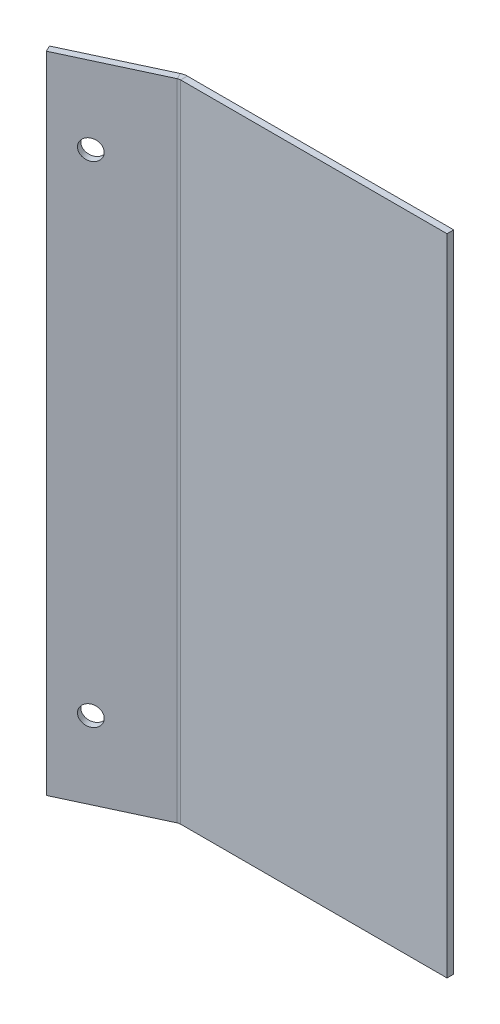
ISO-10303-21;
HEADER;
FILE_DESCRIPTION(('STEP AP214'),'2;1');
FILE_NAME('part.step','',(''),(''),'','','');
FILE_SCHEMA(('AUTOMOTIVE_DESIGN { 1 0 10303 214 1 1 1 1 }'));
ENDSEC;
DATA;
#1=APPLICATION_CONTEXT('core data for automotive mechanical design processes');
#2=APPLICATION_PROTOCOL_DEFINITION('international standard','automotive_design',2000,#1);
#3=PRODUCT_CONTEXT('',#1,'mechanical');
#4=PRODUCT('Part','Part','',(#3));
#5=PRODUCT_RELATED_PRODUCT_CATEGORY('part','',(#4));
#6=PRODUCT_DEFINITION_FORMATION('','',#4);
#7=PRODUCT_DEFINITION_CONTEXT('part definition',#1,'design');
#8=PRODUCT_DEFINITION('design','',#6,#7);
#9=PRODUCT_DEFINITION_SHAPE('','',#8);
#10=(LENGTH_UNIT() NAMED_UNIT(*) SI_UNIT(.MILLI.,.METRE.));
#11=(NAMED_UNIT(*) PLANE_ANGLE_UNIT() SI_UNIT($,.RADIAN.));
#12=(NAMED_UNIT(*) SI_UNIT($,.STERADIAN.) SOLID_ANGLE_UNIT());
#13=UNCERTAINTY_MEASURE_WITH_UNIT(LENGTH_MEASURE(1.E-05),#10,'distance_accuracy_value','');
#14=(GEOMETRIC_REPRESENTATION_CONTEXT(3) GLOBAL_UNCERTAINTY_ASSIGNED_CONTEXT((#13)) GLOBAL_UNIT_ASSIGNED_CONTEXT((#10,
#11,#12)) REPRESENTATION_CONTEXT('',''));
#15=CARTESIAN_POINT('',(0.,0.,0.));
#16=DIRECTION('',(0.,0.,1.));
#17=DIRECTION('',(1.,0.,0.));
#18=AXIS2_PLACEMENT_3D('',#15,#16,#17);
#19=CARTESIAN_POINT('',(11.1796299005498,-15.7574239713775,50.4757998482065));
#20=DIRECTION('',(0.,-1.,0.));
#21=DIRECTION('',(0.90630778703665,0.,-0.4226182617407));
#22=AXIS2_PLACEMENT_3D('',#19,#20,#21);
#23=PLANE('',#22);
#24=DIRECTION('',(0.90630778703665,0.,-0.4226182617407));
#25=VECTOR('',#24,1.);
#26=CARTESIAN_POINT('',(10.7570116388091,-15.7574239713774,49.5694920611699));
#27=LINE('',#26,#25);
#28=CARTESIAN_POINT('',(103.359254936141,-15.7574239713775,6.38835684929166));
#29=VERTEX_POINT('',#28);
#30=CARTESIAN_POINT('',(116.657283211936,-15.7574239713774,0.187384425926738));
#31=VERTEX_POINT('',#30);
#32=EDGE_CURVE('E165',#29,#31,#27,.T.);
#33=ORIENTED_EDGE('',*,*,#32,.T.);
#34=DIRECTION('',(0.4226182617407,0.,0.90630778703665));
#35=VECTOR('',#34,1.);
#36=CARTESIAN_POINT('',(117.079901473676,-15.7574239713775,1.09369221296335));
#37=LINE('',#36,#35);
#38=CARTESIAN_POINT('',(117.079901473676,-15.7574239713774,1.09369221296337));
#39=VERTEX_POINT('',#38);
#40=EDGE_CURVE('E124',#31,#39,#37,.T.);
#41=ORIENTED_EDGE('',*,*,#40,.T.);
#42=DIRECTION('',(0.90630778703665,0.,-0.4226182617407));
#43=VECTOR('',#42,1.);
#44=CARTESIAN_POINT('',(11.1796299005498,-15.7574239713775,50.4757998482065));
#45=LINE('',#44,#43);
#46=CARTESIAN_POINT('',(103.781873197881,-15.7574239713775,7.29466463632831));
#47=VERTEX_POINT('',#46);
#48=EDGE_CURVE('E45',#47,#39,#45,.T.);
#49=ORIENTED_EDGE('',*,*,#48,.F.);
#50=DIRECTION('',(0.4226182617407,0.,0.90630778703665));
#51=VECTOR('',#50,1.);
#52=CARTESIAN_POINT('',(103.781873197881,-15.7574239713775,7.29466463632831));
#53=LINE('',#52,#51);
#54=EDGE_CURVE('E67',#29,#47,#53,.T.);
#55=ORIENTED_EDGE('',*,*,#54,.F.);
#56=EDGE_LOOP('',(#33,#41,#49,#55));
#57=FACE_BOUND('',#56,.T.);
#58=ADVANCED_FACE('F41',(#57),#23,.T.);
#59=CARTESIAN_POINT('',(11.1796299005498,80.2425760286226,50.4757998482064));
#60=DIRECTION('',(0.,-1.,0.));
#61=DIRECTION('',(0.90630778703665,0.,-0.4226182617407));
#62=AXIS2_PLACEMENT_3D('',#59,#60,#61);
#63=PLANE('',#62);
#64=DIRECTION('',(0.90630778703665,0.,-0.4226182617407));
#65=VECTOR('',#64,1.);
#66=CARTESIAN_POINT('',(11.1796299005498,80.2425760286226,50.4757998482064));
#67=LINE('',#66,#65);
#68=CARTESIAN_POINT('',(103.781873197881,80.2425760286226,7.29466463632829));
#69=VERTEX_POINT('',#68);
#70=CARTESIAN_POINT('',(117.079901473676,80.2425760286225,1.09369221296336));
#71=VERTEX_POINT('',#70);
#72=EDGE_CURVE('E156',#69,#71,#67,.T.);
#73=ORIENTED_EDGE('',*,*,#72,.T.);
#74=DIRECTION('',(-0.4226182617407,0.,-0.90630778703665));
#75=VECTOR('',#74,1.);
#76=CARTESIAN_POINT('',(117.079901473676,80.2425760286225,1.09369221296336));
#77=LINE('',#76,#75);
#78=CARTESIAN_POINT('',(116.657283211935,80.2425760286226,0.187384425926738));
#79=VERTEX_POINT('',#78);
#80=EDGE_CURVE('E12',#71,#79,#77,.T.);
#81=ORIENTED_EDGE('',*,*,#80,.T.);
#82=DIRECTION('',(0.90630778703665,0.,-0.4226182617407));
#83=VECTOR('',#82,1.);
#84=CARTESIAN_POINT('',(10.7570116388091,80.2425760286226,49.5694920611697));
#85=LINE('',#84,#83);
#86=CARTESIAN_POINT('',(103.35925493614,80.2425760286226,6.38835684929165));
#87=VERTEX_POINT('',#86);
#88=EDGE_CURVE('E148',#87,#79,#85,.T.);
#89=ORIENTED_EDGE('',*,*,#88,.F.);
#90=DIRECTION('',(0.4226182617407,0.,0.90630778703665));
#91=VECTOR('',#90,1.);
#92=CARTESIAN_POINT('',(103.781873197881,80.2425760286226,7.29466463632829));
#93=LINE('',#92,#91);
#94=EDGE_CURVE('E77',#87,#69,#93,.T.);
#95=ORIENTED_EDGE('',*,*,#94,.T.);
#96=EDGE_LOOP('',(#73,#81,#89,#95));
#97=FACE_BOUND('',#96,.T.);
#98=ADVANCED_FACE('F43',(#97),#63,.F.);
#99=CARTESIAN_POINT('',(11.1796299005498,0.,50.4757998482065));
#100=DIRECTION('',(0.4226182617407,0.,0.90630778703665));
#101=DIRECTION('',(0.90630778703665,0.,-0.4226182617407));
#102=AXIS2_PLACEMENT_3D('',#99,#100,#101);
#103=PLANE('',#102);
#104=CARTESIAN_POINT('',(108.313412133065,-4.25742397137746,5.18157332762481));
#105=DIRECTION('',(0.4226182617407,0.,0.90630778703665));
#106=DIRECTION('',(0.90630778703665,0.,-0.4226182617407));
#107=AXIS2_PLACEMENT_3D('',#104,#105,#106);
#108=CIRCLE('',#107,1.5);
#109=CARTESIAN_POINT('',(109.67287381362,-4.25742397137746,4.54764593501376));
#110=VERTEX_POINT('',#109);
#111=EDGE_CURVE('E180',#110,#110,#108,.T.);
#112=ORIENTED_EDGE('',*,*,#111,.F.);
#113=EDGE_LOOP('',(#112));
#114=FACE_BOUND('',#113,.T.);
#115=CARTESIAN_POINT('',(108.313412133064,68.7425760286226,5.18157332762479));
#116=DIRECTION('',(0.4226182617407,0.,0.90630778703665));
#117=DIRECTION('',(0.90630778703665,0.,-0.4226182617407));
#118=AXIS2_PLACEMENT_3D('',#115,#116,#117);
#119=CIRCLE('',#118,1.5);
#120=CARTESIAN_POINT('',(109.672873813619,68.7425760286226,4.54764593501374));
#121=VERTEX_POINT('',#120);
#122=EDGE_CURVE('E171',#121,#121,#119,.T.);
#123=ORIENTED_EDGE('',*,*,#122,.F.);
#124=EDGE_LOOP('',(#123));
#125=FACE_BOUND('',#124,.T.);
#126=ORIENTED_EDGE('',*,*,#48,.T.);
#127=DIRECTION('',(0.,1.,0.));
#128=VECTOR('',#127,1.);
#129=CARTESIAN_POINT('',(117.079901473676,4.10514989483924E-13,1.09369221296336));
#130=LINE('',#129,#128);
#131=EDGE_CURVE('E175',#39,#71,#130,.T.);
#132=ORIENTED_EDGE('',*,*,#131,.T.);
#133=ORIENTED_EDGE('',*,*,#72,.F.);
#134=DIRECTION('',(0.,-1.,0.));
#135=VECTOR('',#134,1.);
#136=CARTESIAN_POINT('',(103.781873197881,3.20066725715026E-13,7.29466463632831));
#137=LINE('',#136,#135);
#138=EDGE_CURVE('E158',#69,#47,#137,.T.);
#139=ORIENTED_EDGE('',*,*,#138,.T.);
#140=EDGE_LOOP('',(#126,#132,#133,#139));
#141=FACE_BOUND('',#140,.T.);
#142=ADVANCED_FACE('F237',(#114,#125,#141),#103,.T.);
#143=CARTESIAN_POINT('',(103.781873197881,3.20066725715026E-13,7.29466463632831));
#144=DIRECTION('',(-0.90630778703665,0.,0.4226182617407));
#145=DIRECTION('',(0.,-1.,0.));
#146=AXIS2_PLACEMENT_3D('',#143,#144,#145);
#147=PLANE('',#146);
#148=DIRECTION('',(0.,1.,0.));
#149=VECTOR('',#148,1.);
#150=CARTESIAN_POINT('',(103.35925493614,0.,6.38835684929177));
#151=LINE('',#150,#149);
#152=EDGE_CURVE('E151',#87,#29,#151,.F.);
#153=ORIENTED_EDGE('',*,*,#152,.T.);
#154=ORIENTED_EDGE('',*,*,#54,.T.);
#155=ORIENTED_EDGE('',*,*,#138,.F.);
#156=ORIENTED_EDGE('',*,*,#94,.F.);
#157=EDGE_LOOP('',(#153,#154,#155,#156));
#158=FACE_BOUND('',#157,.T.);
#159=ADVANCED_FACE('F250',(#158),#147,.T.);
#160=CARTESIAN_POINT('',(108.313412133065,-4.25742397137746,5.18157332762481));
#161=DIRECTION('',(0.4226182617407,0.,0.90630778703665));
#162=DIRECTION('',(0.90630778703665,0.,-0.4226182617407));
#163=AXIS2_PLACEMENT_3D('',#160,#161,#162);
#164=CYLINDRICAL_SURFACE('',#163,1.5);
#165=ORIENTED_EDGE('',*,*,#111,.T.);
#166=EDGE_LOOP('',(#165));
#167=FACE_BOUND('',#166,.T.);
#168=CARTESIAN_POINT('',(107.890793871324,-4.25742397137746,4.27526554058816));
#169=DIRECTION('',(0.4226182617407,0.,0.90630778703665));
#170=DIRECTION('',(0.90630778703665,0.,-0.4226182617407));
#171=AXIS2_PLACEMENT_3D('',#168,#169,#170);
#172=CIRCLE('',#171,1.5);
#173=CARTESIAN_POINT('',(109.250255551879,-4.25742397137746,3.64133814797712));
#174=VERTEX_POINT('',#173);
#175=EDGE_CURVE('E163',#174,#174,#172,.T.);
#176=ORIENTED_EDGE('',*,*,#175,.F.);
#177=EDGE_LOOP('',(#176));
#178=FACE_BOUND('',#177,.T.);
#179=ADVANCED_FACE('F245',(#167,#178),#164,.F.);
#180=CARTESIAN_POINT('',(108.313412133064,68.7425760286226,5.18157332762479));
#181=DIRECTION('',(0.4226182617407,0.,0.90630778703665));
#182=DIRECTION('',(0.90630778703665,0.,-0.4226182617407));
#183=AXIS2_PLACEMENT_3D('',#180,#181,#182);
#184=CYLINDRICAL_SURFACE('',#183,1.5);
#185=ORIENTED_EDGE('',*,*,#122,.T.);
#186=EDGE_LOOP('',(#185));
#187=FACE_BOUND('',#186,.T.);
#188=CARTESIAN_POINT('',(107.890793871324,68.7425760286226,4.27526554058814));
#189=DIRECTION('',(0.4226182617407,0.,0.90630778703665));
#190=DIRECTION('',(0.90630778703665,0.,-0.4226182617407));
#191=AXIS2_PLACEMENT_3D('',#188,#189,#190);
#192=CIRCLE('',#191,1.5);
#193=CARTESIAN_POINT('',(109.250255551879,68.7425760286226,3.64133814797709));
#194=VERTEX_POINT('',#193);
#195=EDGE_CURVE('E159',#194,#194,#192,.T.);
#196=ORIENTED_EDGE('',*,*,#195,.F.);
#197=EDGE_LOOP('',(#196));
#198=FACE_BOUND('',#197,.T.);
#199=ADVANCED_FACE('F241',(#187,#198),#184,.F.);
#200=CARTESIAN_POINT('',(10.7570116388091,0.,49.5694920611699));
#201=DIRECTION('',(0.4226182617407,0.,0.90630778703665));
#202=DIRECTION('',(0.90630778703665,0.,-0.4226182617407));
#203=AXIS2_PLACEMENT_3D('',#200,#201,#202);
#204=PLANE('',#203);
#205=DIRECTION('',(0.,1.,0.));
#206=VECTOR('',#205,1.);
#207=CARTESIAN_POINT('',(116.657283211936,4.09048737843887E-13,0.187384425926709));
#208=LINE('',#207,#206);
#209=EDGE_CURVE('E50',#31,#79,#208,.T.);
#210=ORIENTED_EDGE('',*,*,#209,.F.);
#211=ORIENTED_EDGE('',*,*,#32,.F.);
#212=ORIENTED_EDGE('',*,*,#152,.F.);
#213=ORIENTED_EDGE('',*,*,#88,.T.);
#214=EDGE_LOOP('',(#210,#211,#212,#213));
#215=FACE_BOUND('',#214,.T.);
#216=ORIENTED_EDGE('',*,*,#175,.T.);
#217=EDGE_LOOP('',(#216));
#218=FACE_BOUND('',#217,.T.);
#219=ORIENTED_EDGE('',*,*,#195,.T.);
#220=EDGE_LOOP('',(#219));
#221=FACE_BOUND('',#220,.T.);
#222=ADVANCED_FACE('F149',(#215,#218,#221),#204,.F.);
#223=CARTESIAN_POINT('',(157.175270500668,0.,1.));
#224=DIRECTION('',(-1.,0.,0.));
#225=DIRECTION('',(0.,-1.,0.));
#226=AXIS2_PLACEMENT_3D('',#223,#224,#225);
#227=PLANE('',#226);
#228=DIRECTION('',(0.,0.,1.));
#229=VECTOR('',#228,1.);
#230=CARTESIAN_POINT('',(157.175270500668,-15.7574239713775,1.));
#231=LINE('',#230,#229);
#232=CARTESIAN_POINT('',(157.175270500668,-15.7574239713775,0.));
#233=VERTEX_POINT('',#232);
#234=CARTESIAN_POINT('',(157.175270500668,-15.7574239713775,1.));
#235=VERTEX_POINT('',#234);
#236=EDGE_CURVE('E200',#233,#235,#231,.T.);
#237=ORIENTED_EDGE('',*,*,#236,.F.);
#238=DIRECTION('',(0.,1.,0.));
#239=VECTOR('',#238,1.);
#240=CARTESIAN_POINT('',(157.175270500668,0.,0.));
#241=LINE('',#240,#239);
#242=CARTESIAN_POINT('',(157.175270500668,80.2425760286225,0.));
#243=VERTEX_POINT('',#242);
#244=EDGE_CURVE('E207',#243,#233,#241,.F.);
#245=ORIENTED_EDGE('',*,*,#244,.F.);
#246=DIRECTION('',(0.,0.,1.));
#247=VECTOR('',#246,1.);
#248=CARTESIAN_POINT('',(157.175270500668,80.2425760286225,1.));
#249=LINE('',#248,#247);
#250=CARTESIAN_POINT('',(157.175270500668,80.2425760286225,1.));
#251=VERTEX_POINT('',#250);
#252=EDGE_CURVE('E192',#243,#251,#249,.T.);
#253=ORIENTED_EDGE('',*,*,#252,.T.);
#254=DIRECTION('',(0.,-1.,0.));
#255=VECTOR('',#254,1.);
#256=CARTESIAN_POINT('',(157.175270500668,0.,1.));
#257=LINE('',#256,#255);
#258=EDGE_CURVE('E194',#251,#235,#257,.T.);
#259=ORIENTED_EDGE('',*,*,#258,.T.);
#260=EDGE_LOOP('',(#237,#245,#253,#259));
#261=FACE_BOUND('',#260,.T.);
#262=ADVANCED_FACE('F222',(#261),#227,.F.);
#263=CARTESIAN_POINT('',(0.,0.,1.));
#264=DIRECTION('',(0.,0.,1.));
#265=DIRECTION('',(1.,0.,0.));
#266=AXIS2_PLACEMENT_3D('',#263,#264,#265);
#267=PLANE('',#266);
#268=DIRECTION('',(0.,1.,0.));
#269=VECTOR('',#268,1.);
#270=CARTESIAN_POINT('',(117.502519735417,4.07668758942912E-13,1.));
#271=LINE('',#270,#269);
#272=CARTESIAN_POINT('',(117.502519735417,-15.7574239713774,1.));
#273=VERTEX_POINT('',#272);
#274=CARTESIAN_POINT('',(117.502519735417,80.2425760286225,1.));
#275=VERTEX_POINT('',#274);
#276=EDGE_CURVE('E186',#273,#275,#271,.T.);
#277=ORIENTED_EDGE('',*,*,#276,.F.);
#278=DIRECTION('',(1.,0.,0.));
#279=VECTOR('',#278,1.);
#280=CARTESIAN_POINT('',(0.,-15.7574239713775,1.));
#281=LINE('',#280,#279);
#282=EDGE_CURVE('E116',#273,#235,#281,.T.);
#283=ORIENTED_EDGE('',*,*,#282,.T.);
#284=ORIENTED_EDGE('',*,*,#258,.F.);
#285=DIRECTION('',(1.,0.,0.));
#286=VECTOR('',#285,1.);
#287=CARTESIAN_POINT('',(0.,80.2425760286225,1.));
#288=LINE('',#287,#286);
#289=EDGE_CURVE('E86',#275,#251,#288,.T.);
#290=ORIENTED_EDGE('',*,*,#289,.F.);
#291=EDGE_LOOP('',(#277,#283,#284,#290));
#292=FACE_BOUND('',#291,.T.);
#293=ADVANCED_FACE('F223',(#292),#267,.T.);
#294=CARTESIAN_POINT('',(0.,-15.7574239713775,1.));
#295=DIRECTION('',(0.,-1.,0.));
#296=DIRECTION('',(1.,0.,0.));
#297=AXIS2_PLACEMENT_3D('',#294,#295,#296);
#298=PLANE('',#297);
#299=DIRECTION('',(0.,0.,1.));
#300=VECTOR('',#299,1.);
#301=CARTESIAN_POINT('',(117.502519735417,-15.7574239713775,1.));
#302=LINE('',#301,#300);
#303=CARTESIAN_POINT('',(117.502519735417,-15.7574239713775,0.));
#304=VERTEX_POINT('',#303);
#305=EDGE_CURVE('E189',#304,#273,#302,.T.);
#306=ORIENTED_EDGE('',*,*,#305,.F.);
#307=DIRECTION('',(1.,0.,0.));
#308=VECTOR('',#307,1.);
#309=CARTESIAN_POINT('',(0.,-15.7574239713775,0.));
#310=LINE('',#309,#308);
#311=EDGE_CURVE('E198',#304,#233,#310,.T.);
#312=ORIENTED_EDGE('',*,*,#311,.T.);
#313=ORIENTED_EDGE('',*,*,#236,.T.);
#314=ORIENTED_EDGE('',*,*,#282,.F.);
#315=EDGE_LOOP('',(#306,#312,#313,#314));
#316=FACE_BOUND('',#315,.T.);
#317=ADVANCED_FACE('F216',(#316),#298,.T.);
#318=CARTESIAN_POINT('',(0.,0.,0.));
#319=DIRECTION('',(0.,0.,1.));
#320=DIRECTION('',(1.,0.,0.));
#321=AXIS2_PLACEMENT_3D('',#318,#319,#320);
#322=PLANE('',#321);
#323=ORIENTED_EDGE('',*,*,#311,.F.);
#324=DIRECTION('',(0.,1.,0.));
#325=VECTOR('',#324,1.);
#326=CARTESIAN_POINT('',(117.502519735417,4.07668758942912E-13,0.));
#327=LINE('',#326,#325);
#328=CARTESIAN_POINT('',(117.502519735417,80.2425760286225,0.));
#329=VERTEX_POINT('',#328);
#330=EDGE_CURVE('E202',#304,#329,#327,.T.);
#331=ORIENTED_EDGE('',*,*,#330,.T.);
#332=DIRECTION('',(1.,0.,0.));
#333=VECTOR('',#332,1.);
#334=CARTESIAN_POINT('',(0.,80.2425760286225,0.));
#335=LINE('',#334,#333);
#336=EDGE_CURVE('E205',#329,#243,#335,.T.);
#337=ORIENTED_EDGE('',*,*,#336,.T.);
#338=ORIENTED_EDGE('',*,*,#244,.T.);
#339=EDGE_LOOP('',(#323,#331,#337,#338));
#340=FACE_BOUND('',#339,.T.);
#341=ADVANCED_FACE('F219',(#340),#322,.F.);
#342=CARTESIAN_POINT('',(0.,80.2425760286225,1.));
#343=DIRECTION('',(0.,-1.,0.));
#344=DIRECTION('',(1.,0.,0.));
#345=AXIS2_PLACEMENT_3D('',#342,#343,#344);
#346=PLANE('',#345);
#347=DIRECTION('',(0.,0.,-1.));
#348=VECTOR('',#347,1.);
#349=CARTESIAN_POINT('',(117.502519735417,80.2425760286225,1.));
#350=LINE('',#349,#348);
#351=EDGE_CURVE('E144',#275,#329,#350,.T.);
#352=ORIENTED_EDGE('',*,*,#351,.F.);
#353=ORIENTED_EDGE('',*,*,#289,.T.);
#354=ORIENTED_EDGE('',*,*,#252,.F.);
#355=ORIENTED_EDGE('',*,*,#336,.F.);
#356=EDGE_LOOP('',(#352,#353,#354,#355));
#357=FACE_BOUND('',#356,.T.);
#358=ADVANCED_FACE('F256',(#357),#346,.F.);
#359=CARTESIAN_POINT('',(117.502519735417,-15.7574239713774,2.));
#360=DIRECTION('',(0.,1.,0.));
#361=DIRECTION('',(0.,0.,1.));
#362=AXIS2_PLACEMENT_3D('',#359,#360,#361);
#363=PLANE('',#362);
#364=ORIENTED_EDGE('',*,*,#40,.F.);
#365=CARTESIAN_POINT('',(117.502519735417,-15.7574239713774,2.));
#366=DIRECTION('',(0.,-1.,0.));
#367=DIRECTION('',(1.,0.,0.));
#368=AXIS2_PLACEMENT_3D('',#365,#366,#367);
#369=CIRCLE('',#368,2.);
#370=EDGE_CURVE('E134',#31,#304,#369,.T.);
#371=ORIENTED_EDGE('',*,*,#370,.T.);
#372=ORIENTED_EDGE('',*,*,#305,.T.);
#373=CARTESIAN_POINT('',(117.502519735417,-15.7574239713774,2.));
#374=DIRECTION('',(0.,-1.,0.));
#375=DIRECTION('',(0.,0.,-1.));
#376=AXIS2_PLACEMENT_3D('',#373,#374,#375);
#377=CIRCLE('',#376,1.);
#378=EDGE_CURVE('E145',#39,#273,#377,.T.);
#379=ORIENTED_EDGE('',*,*,#378,.F.);
#380=EDGE_LOOP('',(#364,#371,#372,#379));
#381=FACE_BOUND('',#380,.T.);
#382=ADVANCED_FACE('F215',(#381),#363,.F.);
#383=CARTESIAN_POINT('',(117.502519735417,80.2425760286226,2.));
#384=DIRECTION('',(0.,-1.,0.));
#385=DIRECTION('',(0.,0.,-1.));
#386=AXIS2_PLACEMENT_3D('',#383,#384,#385);
#387=PLANE('',#386);
#388=CARTESIAN_POINT('',(117.502519735417,80.2425760286226,2.));
#389=DIRECTION('',(0.,-1.,0.));
#390=DIRECTION('',(1.,0.,0.));
#391=AXIS2_PLACEMENT_3D('',#388,#389,#390);
#392=CIRCLE('',#391,2.);
#393=EDGE_CURVE('E133',#329,#79,#392,.F.);
#394=ORIENTED_EDGE('',*,*,#393,.T.);
#395=ORIENTED_EDGE('',*,*,#80,.F.);
#396=CARTESIAN_POINT('',(117.502519735417,80.2425760286226,2.));
#397=DIRECTION('',(0.,1.,0.));
#398=DIRECTION('',(0.,0.,-1.));
#399=AXIS2_PLACEMENT_3D('',#396,#397,#398);
#400=CIRCLE('',#399,1.);
#401=EDGE_CURVE('E58',#275,#71,#400,.T.);
#402=ORIENTED_EDGE('',*,*,#401,.F.);
#403=ORIENTED_EDGE('',*,*,#351,.T.);
#404=EDGE_LOOP('',(#394,#395,#402,#403));
#405=FACE_BOUND('',#404,.T.);
#406=ADVANCED_FACE('F142',(#405),#387,.F.);
#407=CARTESIAN_POINT('',(117.502519735417,128.250015158341,2.));
#408=DIRECTION('',(0.,-1.,0.));
#409=DIRECTION('',(1.,0.,0.));
#410=AXIS2_PLACEMENT_3D('',#407,#408,#409);
#411=CYLINDRICAL_SURFACE('',#410,1.);
#412=ORIENTED_EDGE('',*,*,#276,.T.);
#413=ORIENTED_EDGE('',*,*,#401,.T.);
#414=ORIENTED_EDGE('',*,*,#131,.F.);
#415=ORIENTED_EDGE('',*,*,#378,.T.);
#416=EDGE_LOOP('',(#412,#413,#414,#415));
#417=FACE_BOUND('',#416,.T.);
#418=ADVANCED_FACE('F214',(#417),#411,.F.);
#419=CARTESIAN_POINT('',(117.502519735417,128.250015158341,2.));
#420=DIRECTION('',(0.,-1.,0.));
#421=DIRECTION('',(1.,0.,0.));
#422=AXIS2_PLACEMENT_3D('',#419,#420,#421);
#423=CYLINDRICAL_SURFACE('',#422,2.);
#424=ORIENTED_EDGE('',*,*,#330,.F.);
#425=ORIENTED_EDGE('',*,*,#370,.F.);
#426=ORIENTED_EDGE('',*,*,#209,.T.);
#427=ORIENTED_EDGE('',*,*,#393,.F.);
#428=EDGE_LOOP('',(#424,#425,#426,#427));
#429=FACE_BOUND('',#428,.T.);
#430=ADVANCED_FACE('F132',(#429),#423,.T.);
#431=CLOSED_SHELL('',(#58,#98,#142,#159,#179,#199,#222,#262,#293,#317,#341,#358,#382,#406,#418,#430));
#432=MANIFOLD_SOLID_BREP('B2',#431);
#433=ADVANCED_BREP_SHAPE_REPRESENTATION('',(#18,#432),#14);
#434=SHAPE_DEFINITION_REPRESENTATION(#9,#433);
ENDSEC;
END-ISO-10303-21;
